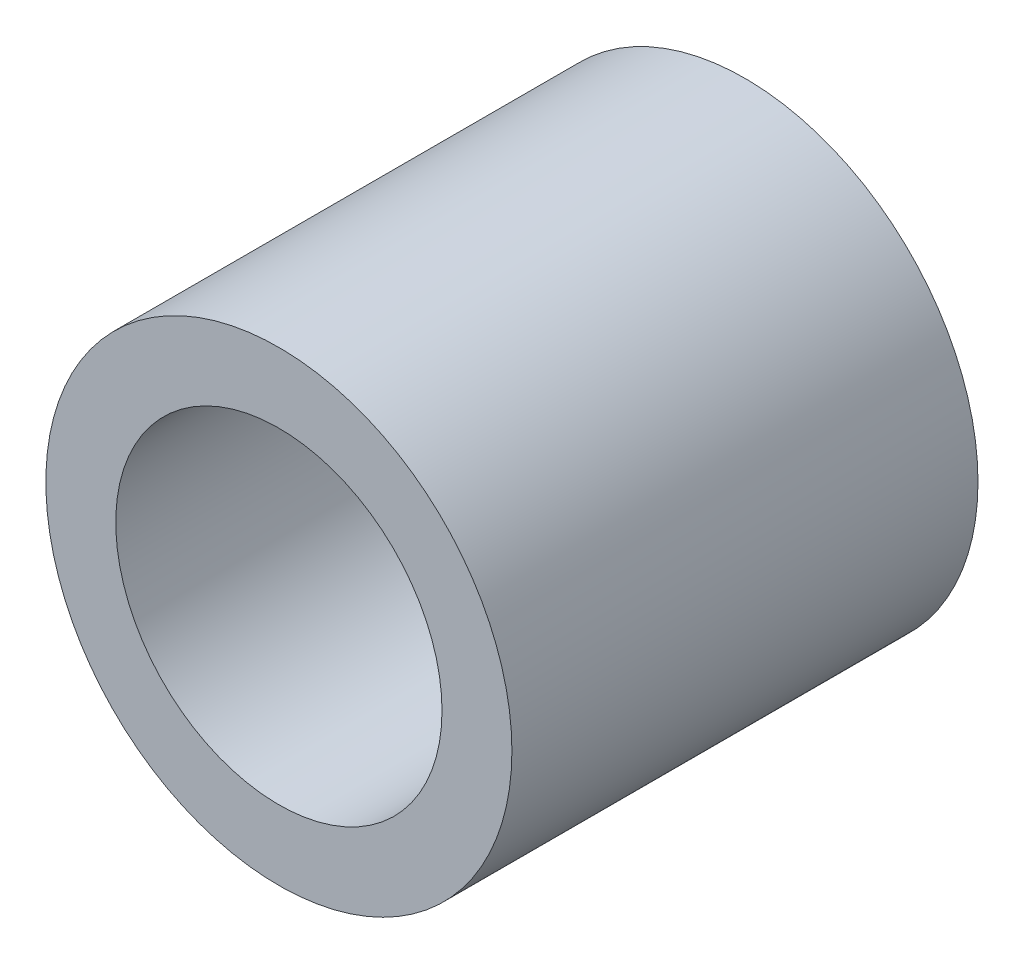
ISO-10303-21;
HEADER;
FILE_DESCRIPTION(('STEP AP214'),'2;1');
FILE_NAME('part.step','',(''),(''),'','','');
FILE_SCHEMA(('AUTOMOTIVE_DESIGN { 1 0 10303 214 1 1 1 1 }'));
ENDSEC;
DATA;
#1=APPLICATION_CONTEXT('core data for automotive mechanical design processes');
#2=APPLICATION_PROTOCOL_DEFINITION('international standard','automotive_design',2000,#1);
#3=PRODUCT_CONTEXT('',#1,'mechanical');
#4=PRODUCT('Part','Part','',(#3));
#5=PRODUCT_RELATED_PRODUCT_CATEGORY('part','',(#4));
#6=PRODUCT_DEFINITION_FORMATION('','',#4);
#7=PRODUCT_DEFINITION_CONTEXT('part definition',#1,'design');
#8=PRODUCT_DEFINITION('design','',#6,#7);
#9=PRODUCT_DEFINITION_SHAPE('','',#8);
#10=(LENGTH_UNIT() NAMED_UNIT(*) SI_UNIT(.MILLI.,.METRE.));
#11=(NAMED_UNIT(*) PLANE_ANGLE_UNIT() SI_UNIT($,.RADIAN.));
#12=(NAMED_UNIT(*) SI_UNIT($,.STERADIAN.) SOLID_ANGLE_UNIT());
#13=UNCERTAINTY_MEASURE_WITH_UNIT(LENGTH_MEASURE(1.E-05),#10,'distance_accuracy_value','');
#14=(GEOMETRIC_REPRESENTATION_CONTEXT(3) GLOBAL_UNCERTAINTY_ASSIGNED_CONTEXT((#13)) GLOBAL_UNIT_ASSIGNED_CONTEXT((#10,
#11,#12)) REPRESENTATION_CONTEXT('',''));
#15=CARTESIAN_POINT('',(0.,0.,0.));
#16=DIRECTION('',(0.,0.,1.));
#17=DIRECTION('',(1.,0.,0.));
#18=AXIS2_PLACEMENT_3D('',#15,#16,#17);
#19=CARTESIAN_POINT('',(0.,0.,50.));
#20=DIRECTION('',(0.,0.,1.));
#21=DIRECTION('',(1.,0.,0.));
#22=AXIS2_PLACEMENT_3D('',#19,#20,#21);
#23=PLANE('',#22);
#24=CARTESIAN_POINT('',(0.,0.,50.));
#25=DIRECTION('',(0.,0.,1.));
#26=DIRECTION('',(1.,0.,0.));
#27=AXIS2_PLACEMENT_3D('',#24,#25,#26);
#28=CIRCLE('',#27,25.);
#29=CARTESIAN_POINT('',(25.,0.,50.));
#30=VERTEX_POINT('',#29);
#31=EDGE_CURVE('E10',#30,#30,#28,.T.);
#32=ORIENTED_EDGE('',*,*,#31,.T.);
#33=EDGE_LOOP('',(#32));
#34=FACE_BOUND('',#33,.T.);
#35=CARTESIAN_POINT('',(0.,0.,50.));
#36=DIRECTION('',(0.,0.,1.));
#37=DIRECTION('',(1.,0.,0.));
#38=AXIS2_PLACEMENT_3D('',#35,#36,#37);
#39=CIRCLE('',#38,17.5);
#40=CARTESIAN_POINT('',(17.5,0.,50.));
#41=VERTEX_POINT('',#40);
#42=EDGE_CURVE('E44',#41,#41,#39,.T.);
#43=ORIENTED_EDGE('',*,*,#42,.F.);
#44=EDGE_LOOP('',(#43));
#45=FACE_BOUND('',#44,.T.);
#46=ADVANCED_FACE('F33',(#34,#45),#23,.T.);
#47=CARTESIAN_POINT('',(0.,0.,0.));
#48=DIRECTION('',(0.,0.,1.));
#49=DIRECTION('',(1.,0.,0.));
#50=AXIS2_PLACEMENT_3D('',#47,#48,#49);
#51=PLANE('',#50);
#52=CARTESIAN_POINT('',(0.,0.,0.));
#53=DIRECTION('',(0.,0.,1.));
#54=DIRECTION('',(1.,0.,0.));
#55=AXIS2_PLACEMENT_3D('',#52,#53,#54);
#56=CIRCLE('',#55,25.);
#57=CARTESIAN_POINT('',(25.,0.,0.));
#58=VERTEX_POINT('',#57);
#59=EDGE_CURVE('E37',#58,#58,#56,.T.);
#60=ORIENTED_EDGE('',*,*,#59,.F.);
#61=EDGE_LOOP('',(#60));
#62=FACE_BOUND('',#61,.T.);
#63=CARTESIAN_POINT('',(0.,0.,0.));
#64=DIRECTION('',(0.,0.,1.));
#65=DIRECTION('',(1.,0.,0.));
#66=AXIS2_PLACEMENT_3D('',#63,#64,#65);
#67=CIRCLE('',#66,17.5);
#68=CARTESIAN_POINT('',(17.5,0.,0.));
#69=VERTEX_POINT('',#68);
#70=EDGE_CURVE('E46',#69,#69,#67,.T.);
#71=ORIENTED_EDGE('',*,*,#70,.T.);
#72=EDGE_LOOP('',(#71));
#73=FACE_BOUND('',#72,.T.);
#74=ADVANCED_FACE('F56',(#62,#73),#51,.F.);
#75=CARTESIAN_POINT('',(0.,0.,50.));
#76=DIRECTION('',(0.,0.,-1.));
#77=DIRECTION('',(-1.,0.,0.));
#78=AXIS2_PLACEMENT_3D('',#75,#76,#77);
#79=CYLINDRICAL_SURFACE('',#78,25.);
#80=ORIENTED_EDGE('',*,*,#31,.F.);
#81=EDGE_LOOP('',(#80));
#82=FACE_BOUND('',#81,.T.);
#83=ORIENTED_EDGE('',*,*,#59,.T.);
#84=EDGE_LOOP('',(#83));
#85=FACE_BOUND('',#84,.T.);
#86=ADVANCED_FACE('F35',(#82,#85),#79,.T.);
#87=CARTESIAN_POINT('',(0.,0.,50.));
#88=DIRECTION('',(0.,0.,-1.));
#89=DIRECTION('',(-1.,0.,0.));
#90=AXIS2_PLACEMENT_3D('',#87,#88,#89);
#91=CYLINDRICAL_SURFACE('',#90,17.5);
#92=ORIENTED_EDGE('',*,*,#42,.T.);
#93=EDGE_LOOP('',(#92));
#94=FACE_BOUND('',#93,.T.);
#95=ORIENTED_EDGE('',*,*,#70,.F.);
#96=EDGE_LOOP('',(#95));
#97=FACE_BOUND('',#96,.T.);
#98=ADVANCED_FACE('F52',(#94,#97),#91,.F.);
#99=CLOSED_SHELL('',(#46,#74,#86,#98));
#100=MANIFOLD_SOLID_BREP('B2',#99);
#101=ADVANCED_BREP_SHAPE_REPRESENTATION('',(#18,#100),#14);
#102=SHAPE_DEFINITION_REPRESENTATION(#9,#101);
ENDSEC;
END-ISO-10303-21;
